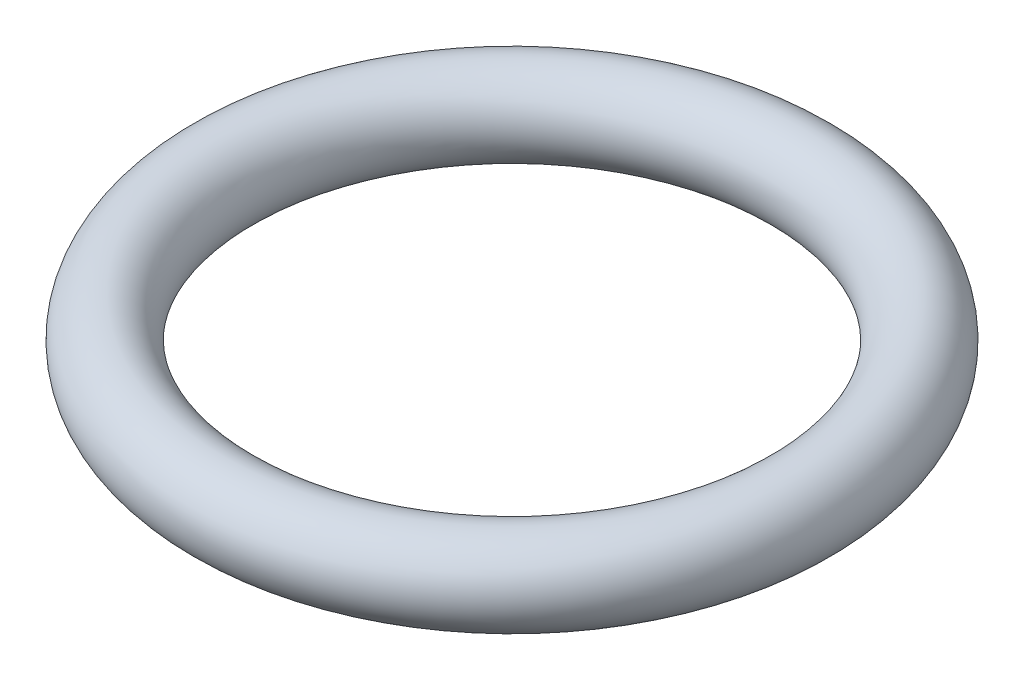
ISO-10303-21;
HEADER;
FILE_DESCRIPTION(('STEP AP214'),'2;1');
FILE_NAME('part.step','',(''),(''),'','','');
FILE_SCHEMA(('AUTOMOTIVE_DESIGN { 1 0 10303 214 1 1 1 1 }'));
ENDSEC;
DATA;
#1=APPLICATION_CONTEXT('core data for automotive mechanical design processes');
#2=APPLICATION_PROTOCOL_DEFINITION('international standard','automotive_design',2000,#1);
#3=PRODUCT_CONTEXT('',#1,'mechanical');
#4=PRODUCT('Part','Part','',(#3));
#5=PRODUCT_RELATED_PRODUCT_CATEGORY('part','',(#4));
#6=PRODUCT_DEFINITION_FORMATION('','',#4);
#7=PRODUCT_DEFINITION_CONTEXT('part definition',#1,'design');
#8=PRODUCT_DEFINITION('design','',#6,#7);
#9=PRODUCT_DEFINITION_SHAPE('','',#8);
#10=(LENGTH_UNIT() NAMED_UNIT(*) SI_UNIT(.MILLI.,.METRE.));
#11=(NAMED_UNIT(*) PLANE_ANGLE_UNIT() SI_UNIT($,.RADIAN.));
#12=(NAMED_UNIT(*) SI_UNIT($,.STERADIAN.) SOLID_ANGLE_UNIT());
#13=UNCERTAINTY_MEASURE_WITH_UNIT(LENGTH_MEASURE(1.E-05),#10,'distance_accuracy_value','');
#14=(GEOMETRIC_REPRESENTATION_CONTEXT(3) GLOBAL_UNCERTAINTY_ASSIGNED_CONTEXT((#13)) GLOBAL_UNIT_ASSIGNED_CONTEXT((#10,
#11,#12)) REPRESENTATION_CONTEXT('',''));
#15=CARTESIAN_POINT('',(0.,0.,0.));
#16=DIRECTION('',(0.,0.,1.));
#17=DIRECTION('',(1.,0.,0.));
#18=AXIS2_PLACEMENT_3D('',#15,#16,#17);
#19=CARTESIAN_POINT('',(0.,0.,0.));
#20=DIRECTION('',(0.,-1.,0.));
#21=DIRECTION('',(0.,0.,-1.));
#22=AXIS2_PLACEMENT_3D('',#19,#20,#21);
#23=TOROIDAL_SURFACE('',#22,9.0805,1.3081);
#24=CARTESIAN_POINT('',(0.,0.,-10.3886));
#25=VERTEX_POINT('',#24);
#26=VERTEX_LOOP('',#25);
#27=FACE_BOUND('',#26,.T.);
#28=ADVANCED_FACE('F28',(#27),#23,.T.);
#29=CLOSED_SHELL('',(#28));
#30=MANIFOLD_SOLID_BREP('B2',#29);
#31=ADVANCED_BREP_SHAPE_REPRESENTATION('',(#18,#30),#14);
#32=SHAPE_DEFINITION_REPRESENTATION(#9,#31);
ENDSEC;
END-ISO-10303-21;
